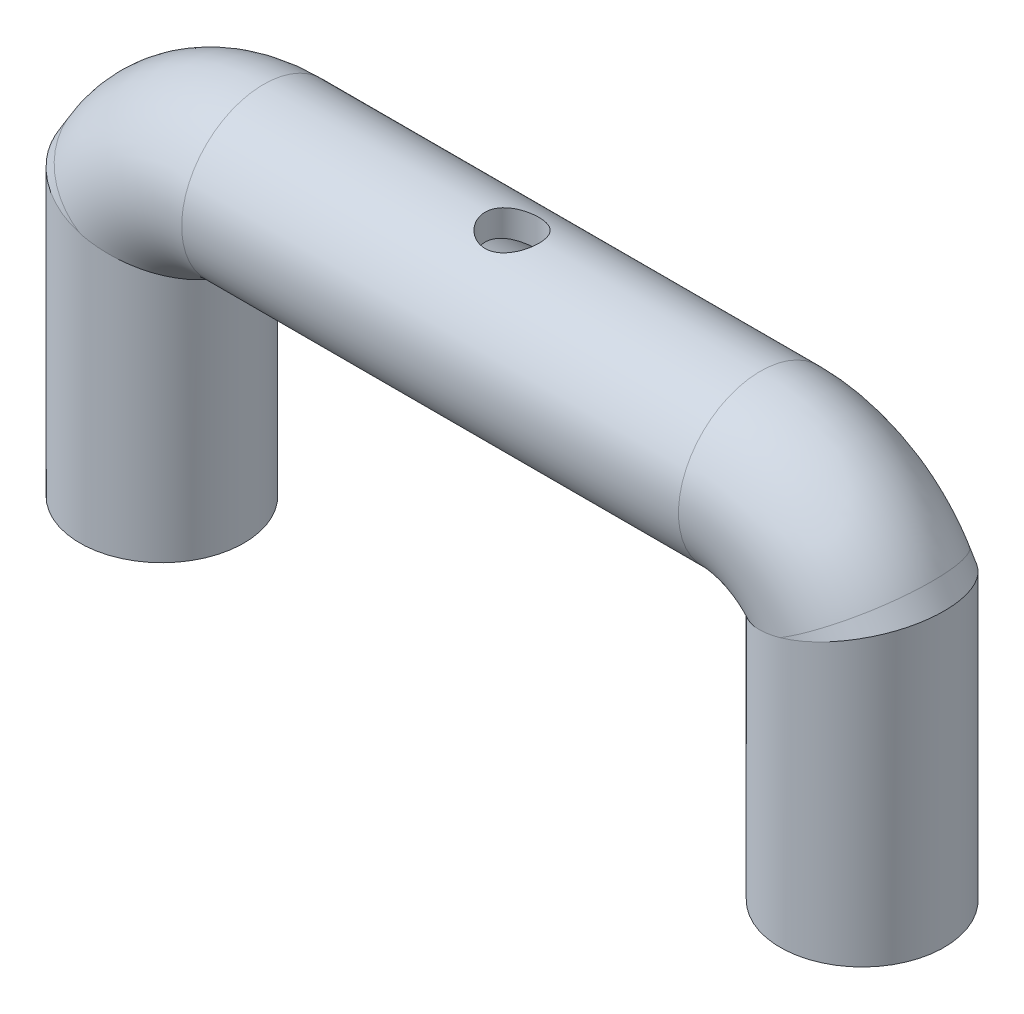
ISO-10303-21;
HEADER;
FILE_DESCRIPTION(('STEP AP214'),'2;1');
FILE_NAME('part.step','',(''),(''),'','','');
FILE_SCHEMA(('AUTOMOTIVE_DESIGN { 1 0 10303 214 1 1 1 1 }'));
ENDSEC;
DATA;
#1=APPLICATION_CONTEXT('core data for automotive mechanical design processes');
#2=APPLICATION_PROTOCOL_DEFINITION('international standard','automotive_design',2000,#1);
#3=PRODUCT_CONTEXT('',#1,'mechanical');
#4=PRODUCT('Part','Part','',(#3));
#5=PRODUCT_RELATED_PRODUCT_CATEGORY('part','',(#4));
#6=PRODUCT_DEFINITION_FORMATION('','',#4);
#7=PRODUCT_DEFINITION_CONTEXT('part definition',#1,'design');
#8=PRODUCT_DEFINITION('design','',#6,#7);
#9=PRODUCT_DEFINITION_SHAPE('','',#8);
#10=(LENGTH_UNIT() NAMED_UNIT(*) SI_UNIT(.MILLI.,.METRE.));
#11=(NAMED_UNIT(*) PLANE_ANGLE_UNIT() SI_UNIT($,.RADIAN.));
#12=(NAMED_UNIT(*) SI_UNIT($,.STERADIAN.) SOLID_ANGLE_UNIT());
#13=UNCERTAINTY_MEASURE_WITH_UNIT(LENGTH_MEASURE(1.E-05),#10,'distance_accuracy_value','');
#14=(GEOMETRIC_REPRESENTATION_CONTEXT(3) GLOBAL_UNCERTAINTY_ASSIGNED_CONTEXT((#13)) GLOBAL_UNIT_ASSIGNED_CONTEXT((#10,
#11,#12)) REPRESENTATION_CONTEXT('',''));
#15=CARTESIAN_POINT('',(0.,0.,0.));
#16=DIRECTION('',(0.,0.,1.));
#17=DIRECTION('',(1.,0.,0.));
#18=AXIS2_PLACEMENT_3D('',#15,#16,#17);
#19=CARTESIAN_POINT('',(-17.6186026200873,-16.369519650655,0.));
#20=DIRECTION('',(0.,1.,0.));
#21=DIRECTION('',(0.,0.,-1.));
#22=AXIS2_PLACEMENT_3D('',#19,#20,#21);
#23=PLANE('',#22);
#24=CARTESIAN_POINT('',(-17.6186026200873,-16.369519650655,0.));
#25=DIRECTION('',(0.,1.,0.));
#26=DIRECTION('',(0.,0.,1.));
#27=AXIS2_PLACEMENT_3D('',#24,#25,#26);
#28=CIRCLE('',#27,2.82085553);
#29=CARTESIAN_POINT('',(-17.6186026200873,-16.369519650655,2.82085553));
#30=VERTEX_POINT('',#29);
#31=EDGE_CURVE('E220',#30,#30,#28,.T.);
#32=ORIENTED_EDGE('',*,*,#31,.T.);
#33=EDGE_LOOP('',(#32));
#34=FACE_BOUND('',#33,.T.);
#35=CARTESIAN_POINT('',(-17.6186026200873,-16.369519650655,0.));
#36=DIRECTION('',(0.,1.,0.));
#37=DIRECTION('',(0.,0.,-1.));
#38=AXIS2_PLACEMENT_3D('',#35,#36,#37);
#39=CIRCLE('',#38,4.125);
#40=CARTESIAN_POINT('',(-17.6186026200873,-16.369519650655,-4.125));
#41=VERTEX_POINT('',#40);
#42=EDGE_CURVE('E173',#41,#41,#39,.T.);
#43=ORIENTED_EDGE('',*,*,#42,.F.);
#44=EDGE_LOOP('',(#43));
#45=FACE_BOUND('',#44,.T.);
#46=ADVANCED_FACE('F55',(#34,#45),#23,.F.);
#47=CARTESIAN_POINT('',(17.6186026200873,-16.369519650655,0.));
#48=DIRECTION('',(0.,-1.,0.));
#49=DIRECTION('',(0.,0.,-1.));
#50=AXIS2_PLACEMENT_3D('',#47,#48,#49);
#51=PLANE('',#50);
#52=CARTESIAN_POINT('',(17.6186026200873,-16.369519650655,0.));
#53=DIRECTION('',(0.,-1.,0.));
#54=DIRECTION('',(0.,0.,-1.));
#55=AXIS2_PLACEMENT_3D('',#52,#53,#54);
#56=CIRCLE('',#55,2.82085552878336);
#57=CARTESIAN_POINT('',(17.6186026200873,-16.369519650655,-2.82085552878336));
#58=VERTEX_POINT('',#57);
#59=EDGE_CURVE('E214',#58,#58,#56,.T.);
#60=ORIENTED_EDGE('',*,*,#59,.F.);
#61=EDGE_LOOP('',(#60));
#62=FACE_BOUND('',#61,.T.);
#63=CARTESIAN_POINT('',(17.6186026200873,-16.369519650655,0.));
#64=DIRECTION('',(0.,-1.,0.));
#65=DIRECTION('',(0.,0.,-1.));
#66=AXIS2_PLACEMENT_3D('',#63,#64,#65);
#67=CIRCLE('',#66,4.125);
#68=CARTESIAN_POINT('',(17.6186026200873,-16.369519650655,-4.125));
#69=VERTEX_POINT('',#68);
#70=EDGE_CURVE('E187',#69,#69,#67,.T.);
#71=ORIENTED_EDGE('',*,*,#70,.T.);
#72=EDGE_LOOP('',(#71));
#73=FACE_BOUND('',#72,.T.);
#74=ADVANCED_FACE('F202',(#62,#73),#51,.T.);
#75=CARTESIAN_POINT('',(-17.6186026200873,-0.214422563276417,0.));
#76=DIRECTION('',(0.,-1.,0.));
#77=DIRECTION('',(1.,0.,0.));
#78=AXIS2_PLACEMENT_3D('',#75,#76,#77);
#79=CYLINDRICAL_SURFACE('',#78,4.125);
#80=CARTESIAN_POINT('',(-17.6186026200873,-2.86951965065504,-4.125));
#81=CARTESIAN_POINT('',(-17.6128968235518,-2.87112613427577,-4.12500001518511));
#82=CARTESIAN_POINT('',(-17.6071912129329,-2.87273380517715,-4.12498817536425));
#83=CARTESIAN_POINT('',(-17.4794190029486,-2.90876407261816,-4.12445766424607));
#84=CARTESIAN_POINT('',(-17.3574623015286,-2.94372410383834,-4.11852700793072));
#85=CARTESIAN_POINT('',(-17.1147496630716,-3.01453967239473,-4.09592886641109));
#86=CARTESIAN_POINT('',(-16.9939946928557,-3.05039586026166,-4.07925335016539));
#87=CARTESIAN_POINT('',(-16.7543334326414,-3.12290187060962,-4.0352857600741));
#88=CARTESIAN_POINT('',(-16.6354322466009,-3.15955338399803,-4.00796842594452));
#89=CARTESIAN_POINT('',(-16.4006428621797,-3.23336648891211,-3.942976559663));
#90=CARTESIAN_POINT('',(-16.2847558712435,-3.2705282760085,-3.90529794479571));
#91=CARTESIAN_POINT('',(-15.9455369494259,-3.38159461080433,-3.77812481046318));
#92=CARTESIAN_POINT('',(-15.7276646239738,-3.45598034738844,-3.67393776836076));
#93=CARTESIAN_POINT('',(-15.3133917273406,-3.60380403675916,-3.42921888424413));
#94=CARTESIAN_POINT('',(-15.1169773685411,-3.67724257108469,-3.28871057785453));
#95=CARTESIAN_POINT('',(-14.7493901569286,-3.82117327471932,-2.97360578390559));
#96=CARTESIAN_POINT('',(-14.5784329563172,-3.89163700604125,-2.79874429441132));
#97=CARTESIAN_POINT('',(-14.2688405463201,-4.02530623529539,-2.41961486625036));
#98=CARTESIAN_POINT('',(-14.1302161712934,-4.0885092966705,-2.21533710750902));
#99=CARTESIAN_POINT('',(-13.9523927352985,-4.17300466652817,-1.89444835598539));
#100=CARTESIAN_POINT('',(-13.8987585135937,-4.19911679025437,-1.7868748486565));
#101=CARTESIAN_POINT('',(-13.800843155311,-4.24769693229892,-1.56678470925341));
#102=CARTESIAN_POINT('',(-13.7565570522542,-4.2701668841541,-1.45427074053258));
#103=CARTESIAN_POINT('',(-13.6778880634209,-4.31072511122053,-1.22517592607922));
#104=CARTESIAN_POINT('',(-13.6434968108956,-4.32881708623008,-1.10859861025656));
#105=CARTESIAN_POINT('',(-13.5850350602011,-4.35993934465224,-0.87222214631851));
#106=CARTESIAN_POINT('',(-13.5609631545917,-4.37297031830439,-0.752423439933808));
#107=CARTESIAN_POINT('',(-13.5253569262034,-4.39238062203634,-0.522612090847803));
#108=CARTESIAN_POINT('',(-13.5128208420264,-4.39928889846613,-0.412798478190806));
#109=CARTESIAN_POINT('',(-13.4966066153212,-4.40824156380489,-0.192323622628078));
#110=CARTESIAN_POINT('',(-13.4929277917471,-4.41028632667532,-0.0816624455490589));
#111=CARTESIAN_POINT('',(-13.4944805147506,-4.40942575167135,0.13954641259957));
#112=CARTESIAN_POINT('',(-13.4997096366412,-4.40652176081657,0.250094116360942));
#113=CARTESIAN_POINT('',(-13.5189976433964,-4.39588874160226,0.470177554052248));
#114=CARTESIAN_POINT('',(-13.5330563606574,-4.38815980483,0.579713307151014));
#115=CARTESIAN_POINT('',(-13.5683861725797,-4.36896030952618,0.788474645258816));
#116=CARTESIAN_POINT('',(-13.5890133065344,-4.35782644382733,0.887840970312597));
#117=CARTESIAN_POINT('',(-13.637394554097,-4.33206093188619,1.08437234287644));
#118=CARTESIAN_POINT('',(-13.6651510823335,-4.3174281007082,1.1815366324302));
#119=CARTESIAN_POINT('',(-13.7587332233055,-4.26887551261055,1.46885715104322));
#120=CARTESIAN_POINT('',(-13.8348933003713,-4.23028912675516,1.65496840128586));
#121=CARTESIAN_POINT('',(-14.0184058331836,-4.14107284385081,2.0247909894453));
#122=CARTESIAN_POINT('',(-14.1275519144452,-4.08979437182865,2.20744528436455));
#123=CARTESIAN_POINT('',(-14.3713486421856,-3.98043050725435,2.55257047140177));
#124=CARTESIAN_POINT('',(-14.5060061310424,-3.92234329013579,2.71503592929804));
#125=CARTESIAN_POINT('',(-14.8124809038865,-3.79598712031622,3.03228779705573));
#126=CARTESIAN_POINT('',(-14.9866882946644,-3.72728410552489,3.18459734480883));
#127=CARTESIAN_POINT('',(-15.3575633820103,-3.5877310373574,3.45780474003969));
#128=CARTESIAN_POINT('',(-15.5542442216624,-3.51687974558674,3.57868406952528));
#129=CARTESIAN_POINT('',(-15.9674437418028,-3.37428076588316,3.78728082663452));
#130=CARTESIAN_POINT('',(-16.1841726707593,-3.30253255134338,3.87458167219847));
#131=CARTESIAN_POINT('',(-16.6293900054862,-3.16078431931182,4.0113841503303));
#132=CARTESIAN_POINT('',(-16.8578577308705,-3.09078152966477,4.06094997809607));
#133=CARTESIAN_POINT('',(-17.2588831125475,-2.97207601384589,4.11284527223674));
#134=CARTESIAN_POINT('',(-17.430083358314,-2.92267615270245,4.12425277156103));
#135=CARTESIAN_POINT('',(-17.6071912281267,-2.8727338006982,4.12498817711629));
#136=CARTESIAN_POINT('',(-17.612896837409,-2.87112613018375,4.12500001678629));
#137=CARTESIAN_POINT('',(-17.6186026200873,-2.86951965065504,4.125));
#138=B_SPLINE_CURVE_WITH_KNOTS('',3,(#80,#81,#82,#83,#84,#85,#86,#87,#88,#89,#90,#91,#92,#93,
#94,#95,#96,#97,#98,#99,#100,#101,#102,#103,#104,#105,#106,#107,#108,#109,#110,#111,#112,#113,
#114,#115,#116,#117,#118,#119,#120,#121,#122,#123,#124,#125,#126,#127,#128,#129,#130,#131,#132,
#133,#134,#135,#136,#137),.UNSPECIFIED.,.F.,.F.,(4,2,2,2,2,2,2,2,2,2,2,2,2,2,2,2,2,2,2,2,2,2,2,
2,2,2,2,2,4),(0.,0.0177833256369088,0.398258975931993,0.779019335917142,1.16068906139759,
1.54250939443769,2.29677632962771,3.05055573121066,3.81039588957597,4.57049029704123,
4.93909706522456,5.30750750392988,5.67560550558406,6.04365328692247,6.37543130893956,
6.70718381931752,7.03884604317264,7.37050197159538,7.67643474571521,7.9824712720326,
8.5941591990063,9.24817048381255,9.90235742901795,10.6233244467794,11.3447152847951,
12.0747874667891,12.8036148499089,13.3378655779384,13.3556489035753),.UNSPECIFIED.);
#139=CARTESIAN_POINT('',(-17.6186026200873,-2.86951965065504,-4.125));
#140=VERTEX_POINT('',#139);
#141=CARTESIAN_POINT('',(-17.6186026200873,-2.86951965065504,4.125));
#142=VERTEX_POINT('',#141);
#143=EDGE_CURVE('E87',#140,#142,#138,.T.);
#144=ORIENTED_EDGE('',*,*,#143,.T.);
#145=CARTESIAN_POINT('',(-17.6186026200873,-2.86951965065504,0.));
#146=DIRECTION('',(-0.271016201839277,-0.962574785842956,0.));
#147=DIRECTION('',(-0.962574785842956,0.271016201839277,0.));
#148=AXIS2_PLACEMENT_3D('',#145,#146,#147);
#149=ELLIPSE('',#148,4.28538131339854,4.125);
#150=EDGE_CURVE('E184',#140,#142,#149,.F.);
#151=ORIENTED_EDGE('',*,*,#150,.F.);
#152=EDGE_LOOP('',(#144,#151));
#153=FACE_BOUND('',#152,.T.);
#154=ORIENTED_EDGE('',*,*,#42,.T.);
#155=EDGE_LOOP('',(#154));
#156=FACE_BOUND('',#155,.T.);
#157=ADVANCED_FACE('F199',(#153,#156),#79,.T.);
#158=CARTESIAN_POINT('',(19.0038908296943,-5.13458413532877,0.));
#159=DIRECTION('',(-0.52174672489083,0.853100436681223,0.));
#160=DIRECTION('',(-0.853100436681223,-0.52174672489083,0.));
#161=AXIS2_PLACEMENT_3D('',#158,#159,#160);
#162=CYLINDRICAL_SURFACE('',#161,4.125);
#163=CARTESIAN_POINT('',(17.6186026200873,-2.86951965065502,0.));
#164=DIRECTION('',(0.52174672489083,-0.853100436681223,0.));
#165=DIRECTION('',(0.,0.,-1.));
#166=AXIS2_PLACEMENT_3D('',#163,#164,#165);
#167=CIRCLE('',#166,4.125);
#168=CARTESIAN_POINT('',(17.6186026200873,-2.86951965065502,-4.125));
#169=VERTEX_POINT('',#168);
#170=CARTESIAN_POINT('',(17.6186026200873,-2.86951965065502,4.125));
#171=VERTEX_POINT('',#170);
#172=EDGE_CURVE('E169',#169,#171,#167,.T.);
#173=ORIENTED_EDGE('',*,*,#172,.T.);
#174=CARTESIAN_POINT('',(17.6186026200873,-2.86951965065502,0.));
#175=DIRECTION('',(-0.271016201839279,0.962574785842955,0.));
#176=DIRECTION('',(0.962574785842955,0.271016201839279,0.));
#177=AXIS2_PLACEMENT_3D('',#174,#175,#176);
#178=ELLIPSE('',#177,4.28538131339854,4.125);
#179=EDGE_CURVE('E70',#169,#171,#178,.F.);
#180=ORIENTED_EDGE('',*,*,#179,.F.);
#181=EDGE_LOOP('',(#173,#180));
#182=FACE_BOUND('',#181,.T.);
#183=ADVANCED_FACE('F201',(#182),#162,.T.);
#184=CARTESIAN_POINT('',(12.5,0.,0.));
#185=DIRECTION('',(-1.,0.,0.));
#186=DIRECTION('',(0.,-1.,0.));
#187=AXIS2_PLACEMENT_3D('',#184,#185,#186);
#188=CYLINDRICAL_SURFACE('',#187,4.125);
#189=CARTESIAN_POINT('',(0.,3.89585805768964,1.35569723549718));
#190=CARTESIAN_POINT('',(-0.0739078534107383,3.89585799352472,1.3556973767797));
#191=CARTESIAN_POINT('',(-0.147815268699046,3.89798419537365,1.34963298634137));
#192=CARTESIAN_POINT('',(-0.293444698492017,3.9062166207932,1.32561459463063));
#193=CARTESIAN_POINT('',(-0.365166299058332,3.91232359337925,1.30765835579692));
#194=CARTESIAN_POINT('',(-0.504291567495977,3.92775274666176,1.26055172260954));
#195=CARTESIAN_POINT('',(-0.571703219931494,3.9370687648645,1.23142277170346));
#196=CARTESIAN_POINT('',(-0.700703960581457,3.95785745730976,1.16287043205964));
#197=CARTESIAN_POINT('',(-0.762291817017567,3.96933058627143,1.1234448721127));
#198=CARTESIAN_POINT('',(-0.880238588188387,3.99363004385837,1.03381267665852));
#199=CARTESIAN_POINT('',(-0.936343696369284,4.00648940808779,0.983280932633549));
#200=CARTESIAN_POINT('',(-1.0394556451426,4.03183274638168,0.873565032909071));
#201=CARTESIAN_POINT('',(-1.08646107008788,4.04431666178245,0.814379533445766));
#202=CARTESIAN_POINT('',(-1.17118367695241,4.06788393884402,0.687187541436307));
#203=CARTESIAN_POINT('',(-1.20863597183339,4.07892390932057,0.618995858322111));
#204=CARTESIAN_POINT('',(-1.27143849763904,4.09797094146668,0.476855685193865));
#205=CARTESIAN_POINT('',(-1.29679189357102,4.10597879620817,0.402908706627987));
#206=CARTESIAN_POINT('',(-1.33381928896926,4.11782536732347,0.254017304831292));
#207=CARTESIAN_POINT('',(-1.34592785124855,4.12179620497289,0.179191659323584));
#208=CARTESIAN_POINT('',(-1.35750249356253,4.12558978412086,0.028472371475718));
#209=CARTESIAN_POINT('',(-1.35697174346895,4.12541356567895,-0.0474209983131043));
#210=CARTESIAN_POINT('',(-1.3435608155009,4.12102298572008,-0.195049500916424));
#211=CARTESIAN_POINT('',(-1.33115243065566,4.11696289982823,-0.266832828054495));
#212=CARTESIAN_POINT('',(-1.29511726879144,4.10545356722444,-0.407235004807981));
#213=CARTESIAN_POINT('',(-1.27148973718208,4.09800409254647,-0.47585364122832));
#214=CARTESIAN_POINT('',(-1.21340524389689,4.08035411904086,-0.609023228210863));
#215=CARTESIAN_POINT('',(-1.17881199620552,4.07011924192028,-0.673509990552733));
#216=CARTESIAN_POINT('',(-1.09988966024577,4.04796681722298,-0.795904430215592));
#217=CARTESIAN_POINT('',(-1.05555791866119,4.03604881138349,-0.853810307994875));
#218=CARTESIAN_POINT('',(-0.956029160957355,4.01114438261399,-0.964207404876447));
#219=CARTESIAN_POINT('',(-0.900427188042629,3.99813402698549,-1.01632866373295));
#220=CARTESIAN_POINT('',(-0.781158363741227,3.97297442744513,-1.1106245585021));
#221=CARTESIAN_POINT('',(-0.717490342571076,3.96082530883405,-1.15279774914621));
#222=CARTESIAN_POINT('',(-0.582753734740002,3.93863506069248,-1.22649338620073));
#223=CARTESIAN_POINT('',(-0.511596745723238,3.92862464531548,-1.25786415764005));
#224=CARTESIAN_POINT('',(-0.364599247770858,3.91220180685396,-1.30805489074665));
#225=CARTESIAN_POINT('',(-0.288760649987379,3.9057879262142,-1.32687993736043));
#226=CARTESIAN_POINT('',(-0.138127484206344,3.89761274506817,-1.35070072224917));
#227=CARTESIAN_POINT('',(-0.0634337800816206,3.8956591645339,-1.35626845649016));
#228=CARTESIAN_POINT('',(0.0858307766241233,3.8960891403735,-1.35503350984096));
#229=CARTESIAN_POINT('',(0.160401648436898,3.89847193690103,-1.34823299619045));
#230=CARTESIAN_POINT('',(0.304734150867248,3.90711491665804,-1.32296794970902));
#231=CARTESIAN_POINT('',(0.374573270647844,3.91324427273119,-1.30489657147228));
#232=CARTESIAN_POINT('',(0.510215430172687,3.92854704507354,-1.25807220185467));
#233=CARTESIAN_POINT('',(0.576017764805303,3.93772099136248,-1.22931735052922));
#234=CARTESIAN_POINT('',(0.703981301496734,3.95843209463157,-1.16092684821292));
#235=CARTESIAN_POINT('',(0.76596608325584,3.97003376679094,-1.12098116172815));
#236=CARTESIAN_POINT('',(0.882559975036544,3.99416601623744,-1.03169666231445));
#237=CARTESIAN_POINT('',(0.937166961723894,4.00669685934029,-0.982355155064768));
#238=CARTESIAN_POINT('',(1.04008177513632,4.03198133261891,-0.872950451543712));
#239=CARTESIAN_POINT('',(1.08797794623116,4.04471817198302,-0.812495024130902));
#240=CARTESIAN_POINT('',(1.17296984997968,4.06840237196432,-0.684092774928852));
#241=CARTESIAN_POINT('',(1.21006599617202,4.07934980109193,-0.61614624011547));
#242=CARTESIAN_POINT('',(1.27206039028697,4.09816763552693,-0.475049841722544));
#243=CARTESIAN_POINT('',(1.29704053350899,4.10605862488349,-0.401938851329223));
#244=CARTESIAN_POINT('',(1.33425273890018,4.11796376761387,-0.252244376276457));
#245=CARTESIAN_POINT('',(1.34648926043303,4.12197927709469,-0.175662116110897));
#246=CARTESIAN_POINT('',(1.35747434804323,4.12558151255035,-0.0249696475507599));
#247=CARTESIAN_POINT('',(1.35681467496983,4.12536254873917,0.0490932561836499));
#248=CARTESIAN_POINT('',(1.34347924912672,4.12099587781997,0.196004073403202));
#249=CARTESIAN_POINT('',(1.33080442575808,4.11684847458632,0.268852080420049));
#250=CARTESIAN_POINT('',(1.29418768666613,4.10516000509983,0.410174824780882));
#251=CARTESIAN_POINT('',(1.27041852224282,4.09767104671506,0.478698937681714));
#252=CARTESIAN_POINT('',(1.21244677649886,4.08007070244225,0.610814663229779));
#253=CARTESIAN_POINT('',(1.1782423267445,4.06995884697412,0.674405389996583));
#254=CARTESIAN_POINT('',(1.09894041623172,4.04770089152289,0.797364139799632));
#255=CARTESIAN_POINT('',(1.05349268755244,4.03549428473905,0.856495167294484));
#256=CARTESIAN_POINT('',(0.953595105247763,4.01057565236812,0.966485515826422));
#257=CARTESIAN_POINT('',(0.899142420298918,3.99786346877623,1.01734222525717));
#258=CARTESIAN_POINT('',(0.780321705362656,3.97279745741083,1.11128831250137));
#259=CARTESIAN_POINT('',(0.715657002702789,3.96047526570409,1.15401206579085));
#260=CARTESIAN_POINT('',(0.579684450972555,3.93817965161905,1.2279515145682));
#261=CARTESIAN_POINT('',(0.508378572102981,3.92820553572816,1.25917060954217));
#262=CARTESIAN_POINT('',(0.365110879766634,3.91231788566714,1.30767455475701));
#263=CARTESIAN_POINT('',(0.293396098785792,3.90621285625222,1.32562545232064));
#264=CARTESIAN_POINT('',(0.147786928880707,3.89798361157478,1.34963481834908));
#265=CARTESIAN_POINT('',(0.0738932454657253,3.89585812184189,1.35569709424258));
#266=CARTESIAN_POINT('',(0.,3.89585805768964,1.35569723549718));
#267=B_SPLINE_CURVE_WITH_KNOTS('',3,(#189,#190,#191,#192,#193,#194,#195,#196,#197,#198,#199,
#200,#201,#202,#203,#204,#205,#206,#207,#208,#209,#210,#211,#212,#213,#214,#215,#216,#217,#218,
#219,#220,#221,#222,#223,#224,#225,#226,#227,#228,#229,#230,#231,#232,#233,#234,#235,#236,#237,
#238,#239,#240,#241,#242,#243,#244,#245,#246,#247,#248,#249,#250,#251,#252,#253,#254,#255,#256,
#257,#258,#259,#260,#261,#262,#263,#264,#265,#266),.UNSPECIFIED.,.T.,.F.,(4,2,2,2,2,2,2,2,2,2,2,
2,2,2,2,2,2,2,2,2,2,2,2,2,2,2,2,2,2,2,2,2,2,2,2,2,2,2,4),(0.,0.221450077909821,
0.442941835543422,0.66401060086456,0.885126019858239,1.11387232620663,1.34265419030723,
1.57722044645573,1.8117253076426,2.03828108832885,2.26478005063926,2.48264009037936,
2.70051478527852,2.92121111297569,3.14196764557059,3.37284518808736,3.60375625216966,
3.83778860823085,4.07172605013097,4.29537117302476,4.51897711123421,4.73518861761012,
4.95143778308766,5.17439932842643,5.39742490617252,5.63083431741248,5.86423479010661,
6.09603486542588,6.32775379987796,6.54886599699394,6.76996109193963,6.98772280903227,
7.20552353917969,7.43122842832471,7.6570044186258,7.89130216416397,8.12553062195992,
8.34700787158702,8.5684141797158),.UNSPECIFIED.);
#268=CARTESIAN_POINT('',(0.,3.89585805768964,1.35569723549718));
#269=VERTEX_POINT('',#268);
#270=EDGE_CURVE('E228',#269,#269,#267,.T.);
#271=ORIENTED_EDGE('',*,*,#270,.T.);
#272=EDGE_LOOP('',(#271));
#273=FACE_BOUND('',#272,.T.);
#274=CARTESIAN_POINT('',(-12.5,0.,0.));
#275=DIRECTION('',(1.,0.,0.));
#276=DIRECTION('',(0.,0.,-1.));
#277=AXIS2_PLACEMENT_3D('',#274,#275,#276);
#278=CIRCLE('',#277,4.125);
#279=CARTESIAN_POINT('',(-12.5,0.,-4.125));
#280=VERTEX_POINT('',#279);
#281=EDGE_CURVE('E177',#280,#280,#278,.T.);
#282=ORIENTED_EDGE('',*,*,#281,.T.);
#283=EDGE_LOOP('',(#282));
#284=FACE_BOUND('',#283,.T.);
#285=CARTESIAN_POINT('',(12.5,0.,0.));
#286=DIRECTION('',(1.,0.,0.));
#287=DIRECTION('',(0.,0.,-1.));
#288=AXIS2_PLACEMENT_3D('',#285,#286,#287);
#289=CIRCLE('',#288,4.125);
#290=CARTESIAN_POINT('',(12.5,0.,-4.125));
#291=VERTEX_POINT('',#290);
#292=EDGE_CURVE('E172',#291,#291,#289,.T.);
#293=ORIENTED_EDGE('',*,*,#292,.F.);
#294=EDGE_LOOP('',(#293));
#295=FACE_BOUND('',#294,.T.);
#296=ADVANCED_FACE('F297',(#273,#284,#295),#188,.T.);
#297=CARTESIAN_POINT('',(-17.6186026200873,-2.86951965065504,0.));
#298=DIRECTION('',(-0.521746724890827,-0.853100436681225,0.));
#299=DIRECTION('',(0.853100436681225,-0.521746724890827,0.));
#300=AXIS2_PLACEMENT_3D('',#297,#298,#299);
#301=CYLINDRICAL_SURFACE('',#300,4.125);
#302=ORIENTED_EDGE('',*,*,#150,.T.);
#303=CARTESIAN_POINT('',(-17.6186026200873,-2.86951965065504,0.));
#304=DIRECTION('',(0.521746724890827,0.853100436681224,0.));
#305=DIRECTION('',(0.,0.,-1.));
#306=AXIS2_PLACEMENT_3D('',#303,#304,#305);
#307=CIRCLE('',#306,4.125);
#308=EDGE_CURVE('E181',#140,#142,#307,.T.);
#309=ORIENTED_EDGE('',*,*,#308,.F.);
#310=EDGE_LOOP('',(#302,#309));
#311=FACE_BOUND('',#310,.T.);
#312=ADVANCED_FACE('F300',(#311),#301,.T.);
#313=CARTESIAN_POINT('',(12.5,-6.,0.));
#314=DIRECTION('',(0.,0.,1.));
#315=DIRECTION('',(1.,0.,0.));
#316=AXIS2_PLACEMENT_3D('',#313,#314,#315);
#317=TOROIDAL_SURFACE('',#316,6.,4.125);
#318=CARTESIAN_POINT('',(17.6186026200873,-2.86951965065502,-4.125));
#319=CARTESIAN_POINT('',(17.6128968235518,-2.87112613427575,-4.12500001518511));
#320=CARTESIAN_POINT('',(17.6071912129329,-2.87273380517713,-4.12498817536425));
#321=CARTESIAN_POINT('',(17.4794190029485,-2.90876407261814,-4.12445766424607));
#322=CARTESIAN_POINT('',(17.3574623015286,-2.94372410383834,-4.11852700793071));
#323=CARTESIAN_POINT('',(17.1147496630716,-3.01453967239473,-4.09592886641109));
#324=CARTESIAN_POINT('',(16.9939946928557,-3.05039586026164,-4.07925335016539));
#325=CARTESIAN_POINT('',(16.7543334326413,-3.1229018706096,-4.0352857600741));
#326=CARTESIAN_POINT('',(16.6354322466009,-3.15955338399801,-4.00796842594452));
#327=CARTESIAN_POINT('',(16.4006428621797,-3.23336648891209,-3.942976559663));
#328=CARTESIAN_POINT('',(16.2847558712435,-3.27052827600848,-3.90529794479571));
#329=CARTESIAN_POINT('',(15.9455369494259,-3.38159461080431,-3.77812481046318));
#330=CARTESIAN_POINT('',(15.7276646239738,-3.45598034738842,-3.67393776836076));
#331=CARTESIAN_POINT('',(15.3133917273406,-3.60380403675913,-3.42921888424416));
#332=CARTESIAN_POINT('',(15.1169773685412,-3.67724257108466,-3.28871057785456));
#333=CARTESIAN_POINT('',(14.7493901569286,-3.82117327471929,-2.97360578390564));
#334=CARTESIAN_POINT('',(14.5784329563173,-3.89163700604122,-2.79874429441137));
#335=CARTESIAN_POINT('',(14.2688405463201,-4.02530623529536,-2.41961486625042));
#336=CARTESIAN_POINT('',(14.1302161712934,-4.08850929667047,-2.21533710750909));
#337=CARTESIAN_POINT('',(13.9523927352985,-4.17300466652815,-1.89444835598546));
#338=CARTESIAN_POINT('',(13.8987585135937,-4.19911679025435,-1.78687484865656));
#339=CARTESIAN_POINT('',(13.8008431553111,-4.2476969322989,-1.56678470925348));
#340=CARTESIAN_POINT('',(13.7565570522542,-4.27016688415408,-1.45427074053265));
#341=CARTESIAN_POINT('',(13.6778880634209,-4.31072511122051,-1.2251759260793));
#342=CARTESIAN_POINT('',(13.6434968108956,-4.32881708623006,-1.10859861025663));
#343=CARTESIAN_POINT('',(13.5850350602011,-4.35993934465223,-0.872222146318582));
#344=CARTESIAN_POINT('',(13.5609631545917,-4.37297031830437,-0.752423439933879));
#345=CARTESIAN_POINT('',(13.5253569262034,-4.39238062203632,-0.522612090847873));
#346=CARTESIAN_POINT('',(13.5128208420264,-4.39928889846612,-0.412798478190876));
#347=CARTESIAN_POINT('',(13.4966066153212,-4.40824156380488,-0.192323622628146));
#348=CARTESIAN_POINT('',(13.4929277917471,-4.41028632667531,-0.081662445549127));
#349=CARTESIAN_POINT('',(13.4944805147505,-4.40942575167134,0.139546412599503));
#350=CARTESIAN_POINT('',(13.4997096366412,-4.40652176081657,0.250094116360875));
#351=CARTESIAN_POINT('',(13.5189976433964,-4.39588874160225,0.470177554052183));
#352=CARTESIAN_POINT('',(13.5330563606573,-4.38815980483,0.57971330715095));
#353=CARTESIAN_POINT('',(13.5683861725797,-4.36896030952618,0.788474645258753));
#354=CARTESIAN_POINT('',(13.5890133065344,-4.35782644382733,0.887840970312534));
#355=CARTESIAN_POINT('',(13.637394554097,-4.33206093188619,1.08437234287638));
#356=CARTESIAN_POINT('',(13.6651510823335,-4.3174281007082,1.18153663243014));
#357=CARTESIAN_POINT('',(13.7587332233055,-4.26887551261055,1.46885715104316));
#358=CARTESIAN_POINT('',(13.8348933003712,-4.23028912675516,1.6549684012858));
#359=CARTESIAN_POINT('',(14.0184058331835,-4.14107284385081,2.02479098944524));
#360=CARTESIAN_POINT('',(14.1275519144452,-4.08979437182866,2.2074452843645));
#361=CARTESIAN_POINT('',(14.3713486421855,-3.98043050725436,2.55257047140171));
#362=CARTESIAN_POINT('',(14.5060061310423,-3.92234329013579,2.71503592929798));
#363=CARTESIAN_POINT('',(14.8124809038865,-3.79598712031623,3.03228779705569));
#364=CARTESIAN_POINT('',(14.9866882946643,-3.7272841055249,3.18459734480878));
#365=CARTESIAN_POINT('',(15.3575633820102,-3.58773103735741,3.45780474003965));
#366=CARTESIAN_POINT('',(15.5542442216623,-3.51687974558674,3.57868406952524));
#367=CARTESIAN_POINT('',(15.9674437418027,-3.37428076588317,3.78728082663449));
#368=CARTESIAN_POINT('',(16.1841726707592,-3.30253255134341,3.87458167219844));
#369=CARTESIAN_POINT('',(16.6293900054862,-3.16078431931179,4.01138415033029));
#370=CARTESIAN_POINT('',(16.8578577308704,-3.09078152966467,4.06094997809606));
#371=CARTESIAN_POINT('',(17.2588831125474,-2.97207601384596,4.11284527223674));
#372=CARTESIAN_POINT('',(17.430083358314,-2.92267615270268,4.12425277156103));
#373=CARTESIAN_POINT('',(17.6071912281267,-2.87273380069819,4.12498817711629));
#374=CARTESIAN_POINT('',(17.6128968374089,-2.87112613018374,4.12500001678629));
#375=CARTESIAN_POINT('',(17.6186026200873,-2.86951965065502,4.125));
#376=B_SPLINE_CURVE_WITH_KNOTS('',3,(#318,#319,#320,#321,#322,#323,#324,#325,#326,#327,#328,
#329,#330,#331,#332,#333,#334,#335,#336,#337,#338,#339,#340,#341,#342,#343,#344,#345,#346,#347,
#348,#349,#350,#351,#352,#353,#354,#355,#356,#357,#358,#359,#360,#361,#362,#363,#364,#365,#366,
#367,#368,#369,#370,#371,#372,#373,#374,#375),.UNSPECIFIED.,.F.,.F.,(4,2,2,2,2,2,2,2,2,2,2,2,2,
2,2,2,2,2,2,2,2,2,2,2,2,2,2,2,4),(0.,0.017783325636909,0.398258975931998,0.779019335917148,
1.1606890613976,1.54250939443769,2.29677632962767,3.05055573121059,3.81039588957589,
4.57049029704116,4.93909706522449,5.30750750392981,5.67560550558399,6.0436532869224,
6.3754313089395,6.70718381931746,7.03884604317258,7.37050197159532,7.67643474571515,
7.98247127203254,8.59415919900623,9.24817048381249,9.90235742901788,10.6233244467793,
11.344715284795,12.074787466789,12.8036148499088,13.3378655779384,13.3556489035753),.UNSPECIFIED.);
#377=EDGE_CURVE('E12',#169,#171,#376,.T.);
#378=ORIENTED_EDGE('',*,*,#377,.T.);
#379=ORIENTED_EDGE('',*,*,#172,.F.);
#380=EDGE_LOOP('',(#378,#379));
#381=FACE_BOUND('',#380,.T.);
#382=ORIENTED_EDGE('',*,*,#292,.T.);
#383=EDGE_LOOP('',(#382));
#384=FACE_BOUND('',#383,.T.);
#385=ADVANCED_FACE('F318',(#381,#384),#317,.T.);
#386=CARTESIAN_POINT('',(-12.5,-6.,0.));
#387=DIRECTION('',(0.,0.,1.));
#388=DIRECTION('',(1.,0.,0.));
#389=AXIS2_PLACEMENT_3D('',#386,#387,#388);
#390=TOROIDAL_SURFACE('',#389,6.,4.125);
#391=ORIENTED_EDGE('',*,*,#308,.T.);
#392=ORIENTED_EDGE('',*,*,#143,.F.);
#393=EDGE_LOOP('',(#391,#392));
#394=FACE_BOUND('',#393,.T.);
#395=ORIENTED_EDGE('',*,*,#281,.F.);
#396=EDGE_LOOP('',(#395));
#397=FACE_BOUND('',#396,.T.);
#398=ADVANCED_FACE('F159',(#394,#397),#390,.T.);
#399=CARTESIAN_POINT('',(17.6186026200873,-16.369519650655,0.));
#400=DIRECTION('',(0.,1.,0.));
#401=DIRECTION('',(-1.,0.,0.));
#402=AXIS2_PLACEMENT_3D('',#399,#400,#401);
#403=CYLINDRICAL_SURFACE('',#402,4.125);
#404=ORIENTED_EDGE('',*,*,#179,.T.);
#405=ORIENTED_EDGE('',*,*,#377,.F.);
#406=EDGE_LOOP('',(#404,#405));
#407=FACE_BOUND('',#406,.T.);
#408=ORIENTED_EDGE('',*,*,#70,.F.);
#409=EDGE_LOOP('',(#408));
#410=FACE_BOUND('',#409,.T.);
#411=ADVANCED_FACE('F155',(#407,#410),#403,.T.);
#412=CARTESIAN_POINT('',(-17.6186026200873,-0.214422563276417,0.));
#413=DIRECTION('',(0.,-1.,0.));
#414=DIRECTION('',(1.,0.,0.));
#415=AXIS2_PLACEMENT_3D('',#412,#413,#414);
#416=CYLINDRICAL_SURFACE('',#415,2.82085553);
#417=CARTESIAN_POINT('',(-17.6186026200873,-2.86951965065504,2.82085553));
#418=CARTESIAN_POINT('',(-17.6138843664896,-2.87084808181566,2.82085558229666));
#419=CARTESIAN_POINT('',(-17.6091660677652,-2.87217738093974,2.82084374177058));
#420=CARTESIAN_POINT('',(-17.4396116126427,-2.91997721754314,2.81999113562382));
#421=CARTESIAN_POINT('',(-17.2747993209953,-2.96748621948206,2.80465614337617));
#422=CARTESIAN_POINT('',(-16.9502672123382,-3.06332260513341,2.7455221844811));
#423=CARTESIAN_POINT('',(-16.7905636446131,-3.11165197111623,2.70164035562035));
#424=CARTESIAN_POINT('',(-16.4812062552691,-3.20765171217886,2.58664553710164));
#425=CARTESIAN_POINT('',(-16.3315427041487,-3.25532268863162,2.51555937188453));
#426=CARTESIAN_POINT('',(-16.0465302834308,-3.34842841327299,2.34800582743901));
#427=CARTESIAN_POINT('',(-15.9111720499933,-3.3938646137346,2.251555197111));
#428=CARTESIAN_POINT('',(-15.6594923568031,-3.48042460642398,2.03626278642482));
#429=CARTESIAN_POINT('',(-15.5430606430958,-3.52157283341167,1.91756005150041));
#430=CARTESIAN_POINT('',(-15.3320716826432,-3.597776560448,1.66031970801459));
#431=CARTESIAN_POINT('',(-15.2375147581882,-3.63283197072677,1.5217818072622));
#432=CARTESIAN_POINT('',(-15.0759521448026,-3.69378072616762,1.23243731798342));
#433=CARTESIAN_POINT('',(-15.0083023966229,-3.71988587869771,1.08203621110189));
#434=CARTESIAN_POINT('',(-14.9000237261083,-3.7621291170813,0.770516377874937));
#435=CARTESIAN_POINT('',(-14.8593762432497,-3.77827404873766,0.609405097342659));
#436=CARTESIAN_POINT('',(-14.8097029008897,-3.79807327657077,0.298983614966186));
#437=CARTESIAN_POINT('',(-14.7978189793766,-3.80285554528497,0.150197197869954));
#438=CARTESIAN_POINT('',(-14.7976759082983,-3.80291255612512,-0.147370563874379));
#439=CARTESIAN_POINT('',(-14.8094111261781,-3.79818956501021,-0.296151901272516));
#440=CARTESIAN_POINT('',(-14.856002354006,-3.77961886947959,-0.589308582097763));
#441=CARTESIAN_POINT('',(-14.8908392345409,-3.7657787146262,-0.733687467614484));
#442=CARTESIAN_POINT('',(-14.9822816428605,-3.72999335383521,-1.01431214305897));
#443=CARTESIAN_POINT('',(-15.0388922771051,-3.70804624667357,-1.1505560164687));
#444=CARTESIAN_POINT('',(-15.1733098523095,-3.65692078077978,-1.41425517718666));
#445=CARTESIAN_POINT('',(-15.2515252837918,-3.62760415713299,-1.54147474774332));
#446=CARTESIAN_POINT('',(-15.4261805912273,-3.56358042742664,-1.78115511833455));
#447=CARTESIAN_POINT('',(-15.5226227916453,-3.5288726339304,-1.89361403283554));
#448=CARTESIAN_POINT('',(-15.7375497347025,-3.45333415139297,-2.10791017170468));
#449=CARTESIAN_POINT('',(-15.857026293132,-3.41225800171518,-2.2086664861182));
#450=CARTESIAN_POINT('',(-16.1103401349207,-3.32736944220127,-2.38883912566824));
#451=CARTESIAN_POINT('',(-16.2441875721346,-3.28355510693623,-2.46824022141938));
#452=CARTESIAN_POINT('',(-16.5296646444156,-3.19241899526866,-2.60727499620736));
#453=CARTESIAN_POINT('',(-16.6818473394798,-3.14503110549228,-2.66573072416842));
#454=CARTESIAN_POINT('',(-16.9937390624611,-3.05031542697241,-2.75554684250044));
#455=CARTESIAN_POINT('',(-17.1534334429436,-3.00298769214542,-2.78695783292373));
#456=CARTESIAN_POINT('',(-17.4108897299522,-2.9284315918803,-2.81486333226251));
#457=CARTESIAN_POINT('',(-17.5076300099472,-2.90080168751707,-2.82033414364641));
#458=CARTESIAN_POINT('',(-17.6091659004851,-2.87217743622274,-2.82084369332411));
#459=CARTESIAN_POINT('',(-17.6138841964038,-2.87084813816648,-2.82085553257628));
#460=CARTESIAN_POINT('',(-17.6186026200873,-2.86951965065504,-2.82085553));
#461=B_SPLINE_CURVE_WITH_KNOTS('',3,(#417,#418,#419,#420,#421,#422,#423,#424,#425,#426,#427,
#428,#429,#430,#431,#432,#433,#434,#435,#436,#437,#438,#439,#440,#441,#442,#443,#444,#445,#446,
#447,#448,#449,#450,#451,#452,#453,#454,#455,#456,#457,#458,#459,#460),.UNSPECIFIED.,.F.,.F.,(4,
2,2,2,2,2,2,2,2,2,2,2,2,2,2,2,2,2,2,2,2,4),(0.,0.014705907314422,0.528466421719377,
1.04372491074599,1.55847664024702,2.0728893138678,2.58418872868735,3.09549567621216,
3.59369703320577,4.09155558664532,4.53744209540285,4.983222284336,5.42863380357266,
5.87414984609367,6.32874604100341,6.78340024985878,7.26605896131855,7.74906097159972,
8.25605740016645,8.76210317642181,9.0638750116578,9.07858091897223),.UNSPECIFIED.);
#462=CARTESIAN_POINT('',(-17.6186026200873,-2.86951965065504,-2.82085553));
#463=VERTEX_POINT('',#462);
#464=CARTESIAN_POINT('',(-17.6186026200873,-2.86951965065504,2.82085553));
#465=VERTEX_POINT('',#464);
#466=EDGE_CURVE('E111',#463,#465,#461,.F.);
#467=ORIENTED_EDGE('',*,*,#466,.F.);
#468=CARTESIAN_POINT('',(-17.6186026200873,-2.86951965065504,0.));
#469=DIRECTION('',(-0.271016201839277,-0.962574785842956,0.));
#470=DIRECTION('',(-0.962574785842956,0.271016201839277,0.));
#471=AXIS2_PLACEMENT_3D('',#468,#469,#470);
#472=ELLIPSE('',#471,2.9305312911658,2.82085553);
#473=EDGE_CURVE('E107',#463,#465,#472,.F.);
#474=ORIENTED_EDGE('',*,*,#473,.T.);
#475=EDGE_LOOP('',(#467,#474));
#476=FACE_BOUND('',#475,.T.);
#477=ORIENTED_EDGE('',*,*,#31,.F.);
#478=EDGE_LOOP('',(#477));
#479=FACE_BOUND('',#478,.T.);
#480=ADVANCED_FACE('F109',(#476,#479),#416,.F.);
#481=CARTESIAN_POINT('',(19.0038908296943,-5.13458413532877,0.));
#482=DIRECTION('',(-0.52174672489083,0.853100436681223,0.));
#483=DIRECTION('',(-0.853100436681223,-0.52174672489083,0.));
#484=AXIS2_PLACEMENT_3D('',#481,#482,#483);
#485=CYLINDRICAL_SURFACE('',#484,2.82085553);
#486=CARTESIAN_POINT('',(17.6186026200873,-2.86951965065502,0.));
#487=DIRECTION('',(-0.52174672489083,0.853100436681223,0.));
#488=DIRECTION('',(-0.853100436681223,-0.52174672489083,0.));
#489=AXIS2_PLACEMENT_3D('',#486,#487,#488);
#490=CIRCLE('',#489,2.82085553);
#491=CARTESIAN_POINT('',(17.6186026200873,-2.86951965065502,-2.82085553));
#492=VERTEX_POINT('',#491);
#493=CARTESIAN_POINT('',(17.6186026200873,-2.86951965065502,2.82085553));
#494=VERTEX_POINT('',#493);
#495=EDGE_CURVE('E223',#492,#494,#490,.F.);
#496=ORIENTED_EDGE('',*,*,#495,.F.);
#497=CARTESIAN_POINT('',(17.6186026200873,-2.86951965065502,0.));
#498=DIRECTION('',(-0.271016201839279,0.962574785842955,0.));
#499=DIRECTION('',(0.962574785842955,0.271016201839279,0.));
#500=AXIS2_PLACEMENT_3D('',#497,#498,#499);
#501=ELLIPSE('',#500,2.9305312911658,2.82085553);
#502=EDGE_CURVE('E96',#492,#494,#501,.F.);
#503=ORIENTED_EDGE('',*,*,#502,.T.);
#504=EDGE_LOOP('',(#496,#503));
#505=FACE_BOUND('',#504,.T.);
#506=ADVANCED_FACE('F146',(#505),#485,.F.);
#507=CARTESIAN_POINT('',(12.5,0.,0.));
#508=DIRECTION('',(-1.,0.,0.));
#509=DIRECTION('',(0.,-1.,0.));
#510=AXIS2_PLACEMENT_3D('',#507,#508,#509);
#511=CYLINDRICAL_SURFACE('',#510,2.82085553);
#512=CARTESIAN_POINT('',(0.,2.47372410078345,1.35569723549718));
#513=CARTESIAN_POINT('',(-0.0710593055788175,2.47372949079173,1.35569272289275));
#514=CARTESIAN_POINT('',(-0.142217731518626,2.47683175653991,1.35007363011581));
#515=CARTESIAN_POINT('',(-0.282383922582338,2.48880316160969,1.32786839708904));
#516=CARTESIAN_POINT('',(-0.351386452878741,2.49768534354642,1.31125745184322));
#517=CARTESIAN_POINT('',(-0.484952901587081,2.51995425874677,1.26792780320661));
#518=CARTESIAN_POINT('',(-0.549537138889698,2.53331842975969,1.24125964554716));
#519=CARTESIAN_POINT('',(-0.673299262763882,2.56301089492149,1.17872612141365));
#520=CARTESIAN_POINT('',(-0.732477223215143,2.57933914855545,1.1428608806482));
#521=CARTESIAN_POINT('',(-0.848714639176387,2.61463761224335,1.05975561523905));
#522=CARTESIAN_POINT('',(-0.905272501524726,2.6337142811386,1.01185891842844));
#523=CARTESIAN_POINT('',(-1.00993797497662,2.67149776688004,0.907419281947116));
#524=CARTESIAN_POINT('',(-1.05804163493401,2.69020440718481,0.850872322468943));
#525=CARTESIAN_POINT('',(-1.14730394702506,2.72650924119607,0.726508698636694));
#526=CARTESIAN_POINT('',(-1.18785845203315,2.74396981315132,0.658214480148035));
#527=CARTESIAN_POINT('',(-1.25667620675172,2.77445327773223,0.514777545032412));
#528=CARTESIAN_POINT('',(-1.28494663596904,2.78747876150761,0.439638859847173));
#529=CARTESIAN_POINT('',(-1.32644956323669,2.80686053229442,0.289949042483218));
#530=CARTESIAN_POINT('',(-1.3405579955949,2.81360312638428,0.21569189703819));
#531=CARTESIAN_POINT('',(-1.35620776944919,2.82109201201846,0.065580914275321));
#532=CARTESIAN_POINT('',(-1.35775606164911,2.82184162004086,-0.0102720166388389));
#533=CARTESIAN_POINT('',(-1.34860996690828,2.81745442601385,-0.154890611359967));
#534=CARTESIAN_POINT('',(-1.33889098523601,2.81278657565659,-0.22373529569377));
#535=CARTESIAN_POINT('',(-1.30921345102483,2.79878190498229,-0.358675961243184));
#536=CARTESIAN_POINT('',(-1.28925413621919,2.78944473709335,-0.424771737440421));
#537=CARTESIAN_POINT('',(-1.23949689290413,2.76679728583945,-0.553532555756304));
#538=CARTESIAN_POINT('',(-1.20956001668416,2.75343116182286,-0.616133675723667));
#539=CARTESIAN_POINT('',(-1.1408707906651,2.72395586925967,-0.73558190107493));
#540=CARTESIAN_POINT('',(-1.1021152249142,2.70784570057003,-0.792426896391633));
#541=CARTESIAN_POINT('',(-1.0129118108774,2.67272776508848,-0.904145451625837));
#542=CARTESIAN_POINT('',(-0.961730097368118,2.65358971928027,-0.958392691764969));
#543=CARTESIAN_POINT('',(-0.851112222734713,2.61553174371476,-1.05785697175024));
#544=CARTESIAN_POINT('',(-0.791670589256446,2.59661196763994,-1.10306797609657));
#545=CARTESIAN_POINT('',(-0.662174362074494,2.56002437950476,-1.18560226409756));
#546=CARTESIAN_POINT('',(-0.591714925872314,2.54248343091396,-1.22235197820707));
#547=CARTESIAN_POINT('',(-0.444561297477481,2.51232735397089,-1.28320017511643));
#548=CARTESIAN_POINT('',(-0.367873257377725,2.49970743483992,-1.3073109702211));
#549=CARTESIAN_POINT('',(-0.216673203694943,2.48214977523994,-1.34033022791578));
#550=CARTESIAN_POINT('',(-0.142447241839348,2.47669597315897,-1.35026503060397));
#551=CARTESIAN_POINT('',(0.0067951863301124,2.47261157148521,-1.35773395510439));
#552=CARTESIAN_POINT('',(0.0818111580156101,2.47397692953096,-1.35527542361044));
#553=CARTESIAN_POINT('',(0.222749098380674,2.48283186044081,-1.33896910795952));
#554=CARTESIAN_POINT('',(0.288846024750109,2.48971298014364,-1.32625210662696));
#555=CARTESIAN_POINT('',(0.417861464279237,2.50795439404433,-1.291423294113));
#556=CARTESIAN_POINT('',(0.480779032267221,2.51931601148635,-1.26930870735347));
#557=CARTESIAN_POINT('',(0.604950125624099,2.54586347923708,-1.21521576020917));
#558=CARTESIAN_POINT('',(0.665991247156693,2.5612022143212,-1.18282761038506));
#559=CARTESIAN_POINT('',(0.782114822169527,2.59382008335138,-1.10947446264722));
#560=CARTESIAN_POINT('',(0.837194246655563,2.61110019466189,-1.06850513558265));
#561=CARTESIAN_POINT('',(0.946428894784652,2.64803696031946,-0.97365291413373));
#562=CARTESIAN_POINT('',(0.999754578528557,2.66773899367723,-0.918828114173793));
#563=CARTESIAN_POINT('',(1.09668225617542,2.70555525751397,-0.800652207173088));
#564=CARTESIAN_POINT('',(1.14028172583654,2.72366907506506,-0.737298893553985));
#565=CARTESIAN_POINT('',(1.21717659235248,2.75673719819333,-0.602123460345285));
#566=CARTESIAN_POINT('',(1.25025832868943,2.77162424418156,-0.530162220357504));
#567=CARTESIAN_POINT('',(1.30353295305405,2.79605872347459,-0.380776903037183));
#568=CARTESIAN_POINT('',(1.32373629012145,2.80561048484422,-0.303357311195975));
#569=CARTESIAN_POINT('',(1.34906634427894,2.81765512439873,-0.152530713721534));
#570=CARTESIAN_POINT('',(1.35535239706473,2.82069010300244,-0.0793610839417146));
#571=CARTESIAN_POINT('',(1.35601405470226,2.82100749115905,0.0670345172563391));
#572=CARTESIAN_POINT('',(1.35039321441864,2.81829161765876,0.140260465335705));
#573=CARTESIAN_POINT('',(1.32819724683214,2.80772737935895,0.280251375239444));
#574=CARTESIAN_POINT('',(1.3122742427815,2.80018483368828,0.347145113557463));
#575=CARTESIAN_POINT('',(1.27076197387382,2.78097273478918,0.477223664096467));
#576=CARTESIAN_POINT('',(1.24517121667909,2.76930254442531,0.540407901969363));
#577=CARTESIAN_POINT('',(1.18383339940146,2.74225855466254,0.664418147093475));
#578=CARTESIAN_POINT('',(1.14768458977032,2.72674289553392,0.725013615870133));
#579=CARTESIAN_POINT('',(1.06677531634054,2.69368848809289,0.839539772807174));
#580=CARTESIAN_POINT('',(1.02201090534115,2.67614881396729,0.893467387447359));
#581=CARTESIAN_POINT('',(0.920319060641562,2.63891203577443,0.99837192256034));
#582=CARTESIAN_POINT('',(0.862649423701641,2.61916548228989,1.04861402204525));
#583=CARTESIAN_POINT('',(0.739308662847841,2.5811723363196,1.13893946682431));
#584=CARTESIAN_POINT('',(0.673631394728383,2.56292691384855,1.17901493776957));
#585=CARTESIAN_POINT('',(0.534246954641861,2.52983384403875,1.24847190553377));
#586=CARTESIAN_POINT('',(0.460402830680613,2.51506347200392,1.27761747321145));
#587=CARTESIAN_POINT('',(0.307977093030712,2.49169706114101,1.32262338454573));
#588=CARTESIAN_POINT('',(0.229412340111506,2.48308031667139,1.33852831035918));
#589=CARTESIAN_POINT('',(0.125096736220825,2.47675852961476,1.35014712621095));
#590=CARTESIAN_POINT('',(0.100140763952326,2.47562394880496,1.35222568914811));
#591=CARTESIAN_POINT('',(0.0501273107358234,2.47410576212002,1.35500157930299));
#592=CARTESIAN_POINT('',(0.0250698240662607,2.47372219918086,1.35569882755044));
#593=CARTESIAN_POINT('',(0.,2.47372410078345,1.35569723549718));
#594=B_SPLINE_CURVE_WITH_KNOTS('',3,(#512,#513,#514,#515,#516,#517,#518,#519,#520,#521,#522,
#523,#524,#525,#526,#527,#528,#529,#530,#531,#532,#533,#534,#535,#536,#537,#538,#539,#540,#541,
#542,#543,#544,#545,#546,#547,#548,#549,#550,#551,#552,#553,#554,#555,#556,#557,#558,#559,#560,
#561,#562,#563,#564,#565,#566,#567,#568,#569,#570,#571,#572,#573,#574,#575,#576,#577,#578,#579,
#580,#581,#582,#583,#584,#585,#586,#587,#588,#589,#590,#591,#592,#593),.UNSPECIFIED.,.T.,.F.,(4,
2,2,2,2,2,2,2,2,2,2,2,2,2,2,2,2,2,2,2,2,2,2,2,2,2,2,2,2,2,2,2,2,2,2,2,2,2,2,2,4),(0.,
0.213072539078607,0.426627560114115,0.639123294295646,0.851616124173642,1.08023497100406,
1.30896038237322,1.55166494869666,1.79422747335599,2.02063956685602,2.24692635675159,
2.45499889176005,2.66308691745452,2.8742031030908,3.08539640116746,3.3153962561522,
3.54554922344161,3.78841391811932,4.03104158245443,4.25501408039222,4.47885382440174,
4.68092654364608,4.88305898662135,5.09456318634881,5.30617434675634,5.54204020031034,
5.77796719703617,6.01841906395836,6.25867558828785,6.47801755760459,6.69729405046893,
6.90389282587943,7.11052350541419,7.32636158336221,7.54229878300369,7.7782179168228,
8.01431922278536,8.25525794444176,8.49538208942731,8.5705500869808,8.64572238179203),.UNSPECIFIED.);
#595=CARTESIAN_POINT('',(0.,2.47372410078345,1.35569723549718));
#596=VERTEX_POINT('',#595);
#597=EDGE_CURVE('E58',#596,#596,#594,.T.);
#598=ORIENTED_EDGE('',*,*,#597,.F.);
#599=EDGE_LOOP('',(#598));
#600=FACE_BOUND('',#599,.T.);
#601=CARTESIAN_POINT('',(-12.5,0.,0.));
#602=DIRECTION('',(-1.,0.,0.));
#603=DIRECTION('',(0.,-1.,0.));
#604=AXIS2_PLACEMENT_3D('',#601,#602,#603);
#605=CIRCLE('',#604,2.82085553);
#606=CARTESIAN_POINT('',(-12.5,-2.82085553,0.));
#607=VERTEX_POINT('',#606);
#608=EDGE_CURVE('E125',#607,#607,#605,.F.);
#609=ORIENTED_EDGE('',*,*,#608,.F.);
#610=EDGE_LOOP('',(#609));
#611=FACE_BOUND('',#610,.T.);
#612=CARTESIAN_POINT('',(12.5,0.,0.));
#613=DIRECTION('',(1.,0.,0.));
#614=DIRECTION('',(0.,1.,0.));
#615=AXIS2_PLACEMENT_3D('',#612,#613,#614);
#616=CIRCLE('',#615,2.82085553);
#617=CARTESIAN_POINT('',(12.5,2.82085553,0.));
#618=VERTEX_POINT('',#617);
#619=EDGE_CURVE('E129',#618,#618,#616,.T.);
#620=ORIENTED_EDGE('',*,*,#619,.T.);
#621=EDGE_LOOP('',(#620));
#622=FACE_BOUND('',#621,.T.);
#623=ADVANCED_FACE('F148',(#600,#611,#622),#511,.F.);
#624=CARTESIAN_POINT('',(-17.6186026200873,-2.86951965065504,0.));
#625=DIRECTION('',(-0.521746724890827,-0.853100436681225,0.));
#626=DIRECTION('',(0.853100436681225,-0.521746724890827,0.));
#627=AXIS2_PLACEMENT_3D('',#624,#625,#626);
#628=CYLINDRICAL_SURFACE('',#627,2.82085553);
#629=ORIENTED_EDGE('',*,*,#473,.F.);
#630=CARTESIAN_POINT('',(-17.6186026200873,-2.86951965065504,0.));
#631=DIRECTION('',(0.521746724890827,0.853100436681224,0.));
#632=DIRECTION('',(-0.853100436681224,0.521746724890827,0.));
#633=AXIS2_PLACEMENT_3D('',#630,#631,#632);
#634=CIRCLE('',#633,2.82085553);
#635=EDGE_CURVE('E120',#463,#465,#634,.T.);
#636=ORIENTED_EDGE('',*,*,#635,.T.);
#637=EDGE_LOOP('',(#629,#636));
#638=FACE_BOUND('',#637,.T.);
#639=ADVANCED_FACE('F123',(#638),#628,.F.);
#640=CARTESIAN_POINT('',(12.5,-6.,0.));
#641=DIRECTION('',(0.,0.,1.));
#642=DIRECTION('',(1.,0.,0.));
#643=AXIS2_PLACEMENT_3D('',#640,#641,#642);
#644=TOROIDAL_SURFACE('',#643,6.,2.82085553);
#645=CARTESIAN_POINT('',(17.6186026200873,-2.86951965065502,2.82085553));
#646=CARTESIAN_POINT('',(17.6138843664896,-2.87084808181563,2.82085558229666));
#647=CARTESIAN_POINT('',(17.6091660677652,-2.8721773809397,2.82084374177058));
#648=CARTESIAN_POINT('',(17.4396116126426,-2.91997721754291,2.81999113562382));
#649=CARTESIAN_POINT('',(17.2747993209952,-2.96748621948201,2.80465614337617));
#650=CARTESIAN_POINT('',(16.9502672123381,-3.06332260513349,2.74552218448107));
#651=CARTESIAN_POINT('',(16.7905636446129,-3.11165197111628,2.7016403556203));
#652=CARTESIAN_POINT('',(16.4812062552688,-3.20765171217889,2.58664553710154));
#653=CARTESIAN_POINT('',(16.3315427041485,-3.25532268863168,2.51555937188441));
#654=CARTESIAN_POINT('',(16.0465302834305,-3.34842841327308,2.34800582743882));
#655=CARTESIAN_POINT('',(15.9111720499929,-3.3938646137347,2.25155519711076));
#656=CARTESIAN_POINT('',(15.6594923568028,-3.48042460642407,2.03626278642452));
#657=CARTESIAN_POINT('',(15.5430606430955,-3.52157283341176,1.91756005150009));
#658=CARTESIAN_POINT('',(15.3320716826429,-3.59777656044808,1.66031970801424));
#659=CARTESIAN_POINT('',(15.237514758188,-3.63283197072684,1.52178180726183));
#660=CARTESIAN_POINT('',(15.0759521448025,-3.69378072616766,1.23243731798308));
#661=CARTESIAN_POINT('',(15.0083023966228,-3.71988587869773,1.08203621110161));
#662=CARTESIAN_POINT('',(14.9000237261082,-3.7621291170813,0.770516377874769));
#663=CARTESIAN_POINT('',(14.8593762432497,-3.77827404873765,0.609405097342553));
#664=CARTESIAN_POINT('',(14.8097029008897,-3.79807327657076,0.298983614966144));
#665=CARTESIAN_POINT('',(14.7978189793765,-3.80285554528496,0.150197197869913));
#666=CARTESIAN_POINT('',(14.7976759082983,-3.8029125561251,-0.14737056387442));
#667=CARTESIAN_POINT('',(14.8094111261781,-3.79818956501019,-0.296151901272557));
#668=CARTESIAN_POINT('',(14.856002354006,-3.77961886947958,-0.589308582097804));
#669=CARTESIAN_POINT('',(14.8908392345409,-3.76577871462618,-0.733687467614524));
#670=CARTESIAN_POINT('',(14.9822816428605,-3.72999335383519,-1.01431214305901));
#671=CARTESIAN_POINT('',(15.0388922771051,-3.70804624667355,-1.15055601646874));
#672=CARTESIAN_POINT('',(15.1733098523095,-3.65692078077976,-1.41425517718669));
#673=CARTESIAN_POINT('',(15.2515252837918,-3.62760415713296,-1.54147474774336));
#674=CARTESIAN_POINT('',(15.4261805912273,-3.56358042742662,-1.78115511833458));
#675=CARTESIAN_POINT('',(15.5226227916453,-3.52887263393037,-1.89361403283558));
#676=CARTESIAN_POINT('',(15.7375497347025,-3.45333415139294,-2.10791017170471));
#677=CARTESIAN_POINT('',(15.8570262931321,-3.41225800171515,-2.20866648611822));
#678=CARTESIAN_POINT('',(16.1103401349207,-3.32736944220124,-2.38883912566826));
#679=CARTESIAN_POINT('',(16.2441875721347,-3.2835551069362,-2.4682402214194));
#680=CARTESIAN_POINT('',(16.5296646444156,-3.19241899526863,-2.60727499620738));
#681=CARTESIAN_POINT('',(16.6818473394799,-3.14503110549225,-2.66573072416844));
#682=CARTESIAN_POINT('',(16.9937390624611,-3.05031542697239,-2.75554684250045));
#683=CARTESIAN_POINT('',(17.1534334429436,-3.00298769214541,-2.78695783292374));
#684=CARTESIAN_POINT('',(17.4108897299522,-2.92843159188025,-2.81486333226251));
#685=CARTESIAN_POINT('',(17.5076300099472,-2.90080168751699,-2.82033414364641));
#686=CARTESIAN_POINT('',(17.6091659004851,-2.87217743622272,-2.82084369332411));
#687=CARTESIAN_POINT('',(17.6138841964037,-2.87084813816646,-2.82085553257628));
#688=CARTESIAN_POINT('',(17.6186026200873,-2.86951965065502,-2.82085553));
#689=B_SPLINE_CURVE_WITH_KNOTS('',3,(#645,#646,#647,#648,#649,#650,#651,#652,#653,#654,#655,
#656,#657,#658,#659,#660,#661,#662,#663,#664,#665,#666,#667,#668,#669,#670,#671,#672,#673,#674,
#675,#676,#677,#678,#679,#680,#681,#682,#683,#684,#685,#686,#687,#688),.UNSPECIFIED.,.F.,.F.,(4,
2,2,2,2,2,2,2,2,2,2,2,2,2,2,2,2,2,2,2,2,4),(0.,0.0147059073144239,0.528466421719485,
1.0437249107462,1.55847664024735,2.07288931386824,2.58418872868779,3.0954956762126,
3.59369703320601,4.09155558664536,4.53744209540289,4.98322228433604,5.4286338035727,
5.87414984609371,6.32874604100346,6.78340024985882,7.2660589613186,7.74906097159977,
8.2560574001665,8.76210317642186,9.06387501165781,9.07858091897223),.UNSPECIFIED.);
#690=EDGE_CURVE('E241',#492,#494,#689,.F.);
#691=ORIENTED_EDGE('',*,*,#690,.F.);
#692=ORIENTED_EDGE('',*,*,#495,.T.);
#693=EDGE_LOOP('',(#691,#692));
#694=FACE_BOUND('',#693,.T.);
#695=ORIENTED_EDGE('',*,*,#619,.F.);
#696=EDGE_LOOP('',(#695));
#697=FACE_BOUND('',#696,.T.);
#698=ADVANCED_FACE('F145',(#694,#697),#644,.F.);
#699=CARTESIAN_POINT('',(-12.5,-6.,0.));
#700=DIRECTION('',(0.,0.,1.));
#701=DIRECTION('',(1.,0.,0.));
#702=AXIS2_PLACEMENT_3D('',#699,#700,#701);
#703=TOROIDAL_SURFACE('',#702,6.,2.82085553);
#704=ORIENTED_EDGE('',*,*,#635,.F.);
#705=ORIENTED_EDGE('',*,*,#466,.T.);
#706=EDGE_LOOP('',(#704,#705));
#707=FACE_BOUND('',#706,.T.);
#708=ORIENTED_EDGE('',*,*,#608,.T.);
#709=EDGE_LOOP('',(#708));
#710=FACE_BOUND('',#709,.T.);
#711=ADVANCED_FACE('F118',(#707,#710),#703,.F.);
#712=CARTESIAN_POINT('',(17.6186026200873,-16.369519650655,0.));
#713=DIRECTION('',(0.,1.,0.));
#714=DIRECTION('',(-1.,0.,0.));
#715=AXIS2_PLACEMENT_3D('',#712,#713,#714);
#716=CYLINDRICAL_SURFACE('',#715,2.82085553);
#717=ORIENTED_EDGE('',*,*,#502,.F.);
#718=ORIENTED_EDGE('',*,*,#690,.T.);
#719=EDGE_LOOP('',(#717,#718));
#720=FACE_BOUND('',#719,.T.);
#721=ORIENTED_EDGE('',*,*,#59,.T.);
#722=EDGE_LOOP('',(#721));
#723=FACE_BOUND('',#722,.T.);
#724=ADVANCED_FACE('F144',(#720,#723),#716,.F.);
#725=CARTESIAN_POINT('',(0.,0.,0.));
#726=DIRECTION('',(0.,1.,0.));
#727=DIRECTION('',(0.,0.,1.));
#728=AXIS2_PLACEMENT_3D('',#725,#726,#727);
#729=CYLINDRICAL_SURFACE('',#728,1.35569723549718);
#730=ORIENTED_EDGE('',*,*,#597,.T.);
#731=EDGE_LOOP('',(#730));
#732=FACE_BOUND('',#731,.T.);
#733=ORIENTED_EDGE('',*,*,#270,.F.);
#734=EDGE_LOOP('',(#733));
#735=FACE_BOUND('',#734,.T.);
#736=ADVANCED_FACE('F251',(#732,#735),#729,.F.);
#737=CLOSED_SHELL('',(#46,#74,#157,#183,#296,#312,#385,#398,#411,#480,#506,#623,#639,#698,#711,
#724,#736));
#738=MANIFOLD_SOLID_BREP('B2',#737);
#739=ADVANCED_BREP_SHAPE_REPRESENTATION('',(#18,#738),#14);
#740=SHAPE_DEFINITION_REPRESENTATION(#9,#739);
ENDSEC;
END-ISO-10303-21;
